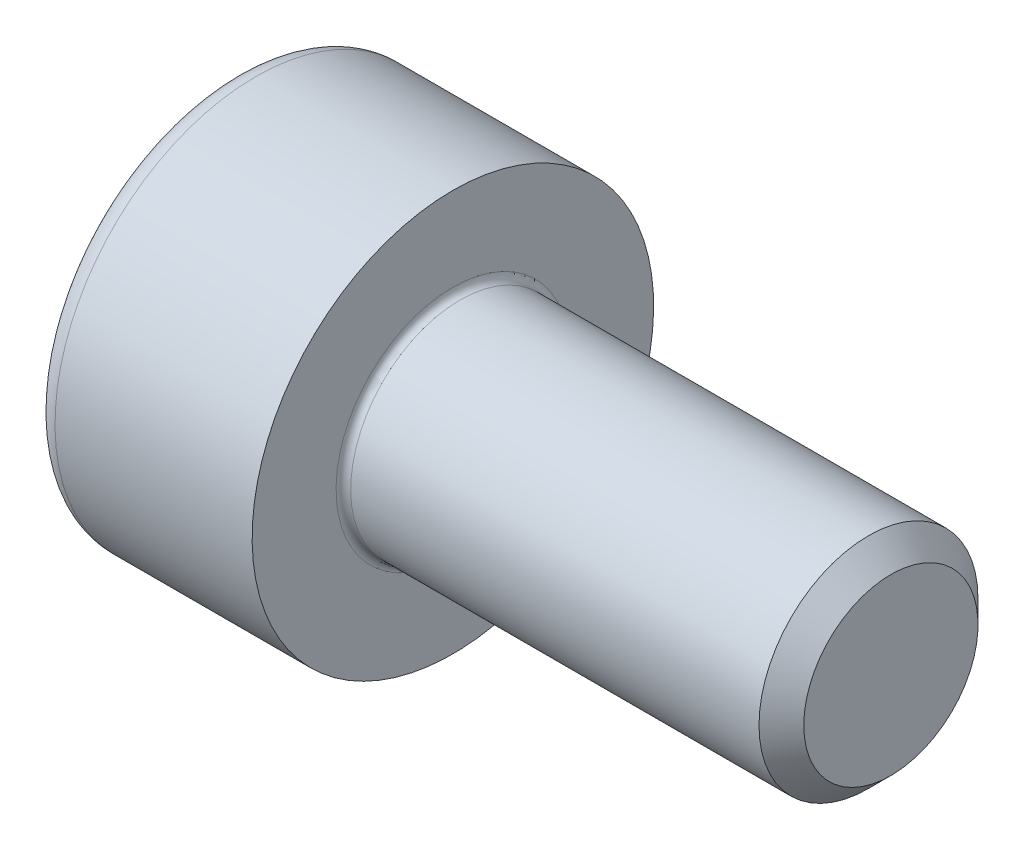
ISO-10303-21;
HEADER;
FILE_DESCRIPTION(('STEP AP214'),'2;1');
FILE_NAME('part.step','',(''),(''),'','','');
FILE_SCHEMA(('AUTOMOTIVE_DESIGN { 1 0 10303 214 1 1 1 1 }'));
ENDSEC;
DATA;
#1=APPLICATION_CONTEXT('core data for automotive mechanical design processes');
#2=APPLICATION_PROTOCOL_DEFINITION('international standard','automotive_design',2000,#1);
#3=PRODUCT_CONTEXT('',#1,'mechanical');
#4=PRODUCT('Part','Part','',(#3));
#5=PRODUCT_RELATED_PRODUCT_CATEGORY('part','',(#4));
#6=PRODUCT_DEFINITION_FORMATION('','',#4);
#7=PRODUCT_DEFINITION_CONTEXT('part definition',#1,'design');
#8=PRODUCT_DEFINITION('design','',#6,#7);
#9=PRODUCT_DEFINITION_SHAPE('','',#8);
#10=(LENGTH_UNIT() NAMED_UNIT(*) SI_UNIT(.MILLI.,.METRE.));
#11=(NAMED_UNIT(*) PLANE_ANGLE_UNIT() SI_UNIT($,.RADIAN.));
#12=(NAMED_UNIT(*) SI_UNIT($,.STERADIAN.) SOLID_ANGLE_UNIT());
#13=UNCERTAINTY_MEASURE_WITH_UNIT(LENGTH_MEASURE(1.E-05),#10,'distance_accuracy_value','');
#14=(GEOMETRIC_REPRESENTATION_CONTEXT(3) GLOBAL_UNCERTAINTY_ASSIGNED_CONTEXT((#13)) GLOBAL_UNIT_ASSIGNED_CONTEXT((#10,
#11,#12)) REPRESENTATION_CONTEXT('',''));
#15=CARTESIAN_POINT('',(0.,0.,0.));
#16=DIRECTION('',(0.,0.,1.));
#17=DIRECTION('',(1.,0.,0.));
#18=AXIS2_PLACEMENT_3D('',#15,#16,#17);
#19=CARTESIAN_POINT('',(-1.70500000086804,0.,0.));
#20=DIRECTION('',(-1.,0.,0.));
#21=DIRECTION('',(0.,0.,1.));
#22=AXIS2_PLACEMENT_3D('',#19,#20,#21);
#23=CONICAL_SURFACE('',#22,1.45203592649068,1.04719754999109);
#24=CARTESIAN_POINT('',(-0.866666665501725,0.,0.));
#25=VERTEX_POINT('',#24);
#26=VERTEX_LOOP('',#25);
#27=FACE_BOUND('',#26,.T.);
#28=CARTESIAN_POINT('',(-1.7000000009372,1.25000000021346,0.721687836216483));
#29=CARTESIAN_POINT('',(-1.68168471667994,1.25000000007667,0.658260216767755));
#30=CARTESIAN_POINT('',(-1.66502792415718,1.25000000002055,0.594285091020223));
#31=CARTESIAN_POINT('',(-1.63595399305092,1.2499999999794,0.4652271530211));
#32=CARTESIAN_POINT('',(-1.62354713859959,1.24999999999455,0.400142048406154));
#33=CARTESIAN_POINT('',(-1.604234975185,1.25000000000532,0.270778406250591));
#34=CARTESIAN_POINT('',(-1.59720111808345,1.25000000000142,0.206519767389044));
#35=CARTESIAN_POINT('',(-1.5888057309149,1.24999999999859,0.0777002892859716));
#36=CARTESIAN_POINT('',(-1.58743724707345,1.24999999999965,0.0131399179469562));
#37=CARTESIAN_POINT('',(-1.59029143221315,1.25000000000031,-0.107484209972956));
#38=CARTESIAN_POINT('',(-1.59381330414069,1.25000000000008,-0.16356606718727));
#39=CARTESIAN_POINT('',(-1.60497331386054,1.24999999999992,-0.275364426607982));
#40=CARTESIAN_POINT('',(-1.61261526015917,1.24999999999998,-0.331080542422315));
#41=CARTESIAN_POINT('',(-1.63171864680269,1.25000000000003,-0.443109217006171));
#42=CARTESIAN_POINT('',(-1.6432610273734,1.25000000000001,-0.499407604187637));
#43=CARTESIAN_POINT('',(-1.66945735155487,1.24999999999999,-0.611164930960381));
#44=CARTESIAN_POINT('',(-1.68410514402294,1.24999999999998,-0.666625301187755));
#45=CARTESIAN_POINT('',(-1.700000001076,1.25,-0.721687836213198));
#46=B_SPLINE_CURVE_WITH_KNOTS('',3,(#28,#29,#30,#31,#32,#33,#34,#35,#36,#37,#38,#39,#40,#41,#42,
#43,#44,#45),.UNSPECIFIED.,.F.,.F.,(4,2,2,2,2,2,2,2,4),(0.,0.198135007256359,0.39674613571563,
0.590442253939293,0.78390055567162,0.952317364102674,1.12089012092803,1.29320101371929,
1.46517373296543),.UNSPECIFIED.);
#47=CARTESIAN_POINT('',(-1.7000000010662,1.24999999986673,0.721687836410083));
#48=VERTEX_POINT('',#47);
#49=CARTESIAN_POINT('',(-1.70000000111063,1.25,-0.72168783633314));
#50=VERTEX_POINT('',#49);
#51=EDGE_CURVE('E21',#48,#50,#46,.T.);
#52=ORIENTED_EDGE('',*,*,#51,.T.);
#53=CARTESIAN_POINT('',(-1.7000000009372,1.24999999987243,-0.721687836807172));
#54=CARTESIAN_POINT('',(-1.68168471667994,1.19507007005986,-0.753401646413066));
#55=CARTESIAN_POINT('',(-1.66502792415718,1.13966598592414,-0.785389209238232));
#56=CARTESIAN_POINT('',(-1.63595399305092,1.02789853303629,-0.84991817820216));
#57=CARTESIAN_POINT('',(-1.62354713859959,0.971533179039347,-0.882460730522748));
#58=CARTESIAN_POINT('',(-1.604234975185,0.859500978611936,-0.947142551609857));
#59=CARTESIAN_POINT('',(-1.59720111808344,0.803851364943275,-0.979271871037253));
#60=CARTESIAN_POINT('',(-1.5888057309149,0.692290424402345,-1.04368161008634));
#61=CARTESIAN_POINT('',(-1.58743724707344,0.636379502745531,-1.07596179575676));
#62=CARTESIAN_POINT('',(-1.59029143221314,0.531915943657876,-1.13627385971729));
#63=CARTESIAN_POINT('',(-1.59381330414069,0.483347630618755,-1.16431478832425));
#64=CARTESIAN_POINT('',(-1.60497331386054,0.386527411258912,-1.22021396803447));
#65=CARTESIAN_POINT('',(-1.61261526015917,0.338275839563533,-1.24807202594168));
#66=CARTESIAN_POINT('',(-1.63171864680269,0.241256161421637,-1.30408636323365));
#67=CARTESIAN_POINT('',(-1.6432610273734,0.192500327930389,-1.33223555682438));
#68=CARTESIAN_POINT('',(-1.66945735155487,0.0957156438861422,-1.38811422021073));
#69=CARTESIAN_POINT('',(-1.68410514402294,0.0476855543659396,-1.4158444053244));
#70=CARTESIAN_POINT('',(-1.700000001076,2.37148032441625E-10,-1.44337567283715));
#71=B_SPLINE_CURVE_WITH_KNOTS('',3,(#53,#54,#55,#56,#57,#58,#59,#60,#61,#62,#63,#64,#65,#66,#67,
#68,#69,#70),.UNSPECIFIED.,.F.,.F.,(4,2,2,2,2,2,2,2,4),(0.,0.198135007256359,0.39674613571563,
0.590442253939292,0.78390055567162,0.952317364102674,1.12089012092803,1.2932010137193,
1.46517373296543),.UNSPECIFIED.);
#72=CARTESIAN_POINT('',(-1.7000000010662,0.,-1.44337567282017));
#73=VERTEX_POINT('',#72);
#74=EDGE_CURVE('E81',#50,#73,#71,.T.);
#75=ORIENTED_EDGE('',*,*,#74,.T.);
#76=CARTESIAN_POINT('',(-1.7000000009372,-3.41032918427961E-10,-1.44337567302366));
#77=CARTESIAN_POINT('',(-1.68168471667994,-0.0549299300168043,-1.41166186318082));
#78=CARTESIAN_POINT('',(-1.66502792415718,-0.110334014096412,-1.37967430025846));
#79=CARTESIAN_POINT('',(-1.63595399305092,-0.222101466943117,-1.31514533122326));
#80=CARTESIAN_POINT('',(-1.62354713859959,-0.2784668209552,-1.2826027789289));
#81=CARTESIAN_POINT('',(-1.604234975185,-0.390499021393382,-1.21792095786045));
#82=CARTESIAN_POINT('',(-1.59720111808344,-0.446148635058142,-1.1857916384263));
#83=CARTESIAN_POINT('',(-1.5888057309149,-0.557709575596239,-1.12138189937231));
#84=CARTESIAN_POINT('',(-1.58743724707344,-0.613620497254114,-1.08910171370372));
#85=CARTESIAN_POINT('',(-1.59029143221314,-0.718084056342434,-1.02878964974434));
#86=CARTESIAN_POINT('',(-1.59381330414069,-0.766652369381328,-1.00074872113699));
#87=CARTESIAN_POINT('',(-1.60497331386054,-0.863472588741005,-0.944849541426487));
#88=CARTESIAN_POINT('',(-1.61261526015917,-0.911724160436443,-0.916991483519372));
#89=CARTESIAN_POINT('',(-1.63171864680269,-1.00874383857839,-0.860977146227485));
#90=CARTESIAN_POINT('',(-1.6432610273734,-1.05749967206962,-0.832827952636742));
#91=CARTESIAN_POINT('',(-1.66945735155487,-1.15428435611385,-0.776949289250349));
#92=CARTESIAN_POINT('',(-1.68410514402294,-1.20231444563404,-0.749219104136651));
#93=CARTESIAN_POINT('',(-1.700000001076,-1.24999999976285,-0.721687836623951));
#94=B_SPLINE_CURVE_WITH_KNOTS('',3,(#76,#77,#78,#79,#80,#81,#82,#83,#84,#85,#86,#87,#88,#89,#90,
#91,#92,#93),.UNSPECIFIED.,.F.,.F.,(4,2,2,2,2,2,2,2,4),(0.,0.198135007256359,0.39674613571563,
0.590442253939293,0.783900555671621,0.952317364102675,1.12089012092803,1.2932010137193,
1.46517373296543),.UNSPECIFIED.);
#95=CARTESIAN_POINT('',(-1.7000000010662,-1.24999999986673,-0.721687836410085));
#96=VERTEX_POINT('',#95);
#97=EDGE_CURVE('E106',#73,#96,#94,.T.);
#98=ORIENTED_EDGE('',*,*,#97,.T.);
#99=CARTESIAN_POINT('',(-1.7000000009372,-1.25000000021346,-0.721687836216485));
#100=CARTESIAN_POINT('',(-1.68168471667994,-1.25000000007667,-0.658260216767758));
#101=CARTESIAN_POINT('',(-1.66502792415718,-1.25000000002055,-0.594285091020225));
#102=CARTESIAN_POINT('',(-1.63595399305092,-1.2499999999794,-0.465227153021103));
#103=CARTESIAN_POINT('',(-1.62354713859959,-1.24999999999455,-0.400142048406156));
#104=CARTESIAN_POINT('',(-1.604234975185,-1.25000000000532,-0.270778406250594));
#105=CARTESIAN_POINT('',(-1.59720111808345,-1.25000000000142,-0.206519767389046));
#106=CARTESIAN_POINT('',(-1.5888057309149,-1.24999999999859,-0.0777002892859738));
#107=CARTESIAN_POINT('',(-1.58743724707345,-1.24999999999965,-0.0131399179469584));
#108=CARTESIAN_POINT('',(-1.59029143221314,-1.25000000000031,0.107484209972954));
#109=CARTESIAN_POINT('',(-1.59381330414069,-1.25000000000008,0.163566067187268));
#110=CARTESIAN_POINT('',(-1.60497331386054,-1.24999999999992,0.27536442660798));
#111=CARTESIAN_POINT('',(-1.61261526015917,-1.24999999999998,0.331080542422314));
#112=CARTESIAN_POINT('',(-1.63171864680269,-1.25000000000003,0.44310921700617));
#113=CARTESIAN_POINT('',(-1.6432610273734,-1.25000000000001,0.499407604187636));
#114=CARTESIAN_POINT('',(-1.66945735155487,-1.24999999999999,0.61116493096038));
#115=CARTESIAN_POINT('',(-1.68410514402294,-1.24999999999998,0.666625301187754));
#116=CARTESIAN_POINT('',(-1.700000001076,-1.25,0.721687836213197));
#117=B_SPLINE_CURVE_WITH_KNOTS('',3,(#99,#100,#101,#102,#103,#104,#105,#106,#107,#108,#109,#110,
#111,#112,#113,#114,#115,#116),.UNSPECIFIED.,.F.,.F.,(4,2,2,2,2,2,2,2,4),(0.,0.198135007256359,
0.39674613571563,0.590442253939293,0.783900555671621,0.952317364102675,1.12089012092803,
1.2932010137193,1.46517373296543),.UNSPECIFIED.);
#118=CARTESIAN_POINT('',(-1.7000000010662,-1.24999999986673,0.721687836410086));
#119=VERTEX_POINT('',#118);
#120=EDGE_CURVE('E130',#96,#119,#117,.T.);
#121=ORIENTED_EDGE('',*,*,#120,.T.);
#122=CARTESIAN_POINT('',(-1.7000000009372,-1.24999999987243,0.721687836807171));
#123=CARTESIAN_POINT('',(-1.68168471667994,-1.19507007005986,0.753401646413066));
#124=CARTESIAN_POINT('',(-1.66502792415718,-1.13966598592414,0.785389209238232));
#125=CARTESIAN_POINT('',(-1.63595399305092,-1.02789853303629,0.84991817820216));
#126=CARTESIAN_POINT('',(-1.62354713859959,-0.971533179039349,0.882460730522749));
#127=CARTESIAN_POINT('',(-1.604234975185,-0.859500978611937,0.947142551609858));
#128=CARTESIAN_POINT('',(-1.59720111808345,-0.803851364943277,0.979271871037254));
#129=CARTESIAN_POINT('',(-1.5888057309149,-0.692290424402346,1.04368161008634));
#130=CARTESIAN_POINT('',(-1.58743724707345,-0.636379502745532,1.07596179575676));
#131=CARTESIAN_POINT('',(-1.59029143221314,-0.531915943657877,1.13627385971729));
#132=CARTESIAN_POINT('',(-1.59381330414069,-0.483347630618756,1.16431478832426));
#133=CARTESIAN_POINT('',(-1.60497331386054,-0.386527411258913,1.22021396803447));
#134=CARTESIAN_POINT('',(-1.61261526015917,-0.338275839563534,1.24807202594169));
#135=CARTESIAN_POINT('',(-1.63171864680269,-0.241256161421638,1.30408636323366));
#136=CARTESIAN_POINT('',(-1.6432610273734,-0.192500327930391,1.33223555682438));
#137=CARTESIAN_POINT('',(-1.66945735155487,-0.0957156438861436,1.38811422021073));
#138=CARTESIAN_POINT('',(-1.68410514402294,-0.047685554365941,1.4158444053244));
#139=CARTESIAN_POINT('',(-1.700000001076,-2.37149471103395E-10,1.44337567283715));
#140=B_SPLINE_CURVE_WITH_KNOTS('',3,(#122,#123,#124,#125,#126,#127,#128,#129,#130,#131,#132,
#133,#134,#135,#136,#137,#138,#139),.UNSPECIFIED.,.F.,.F.,(4,2,2,2,2,2,2,2,4),(0.,
0.198135007256359,0.396746135715631,0.590442253939293,0.783900555671621,0.952317364102675,
1.12089012092803,1.2932010137193,1.46517373296543),.UNSPECIFIED.);
#141=CARTESIAN_POINT('',(-1.7000000010662,0.,1.44337567282017));
#142=VERTEX_POINT('',#141);
#143=EDGE_CURVE('E138',#119,#142,#140,.T.);
#144=ORIENTED_EDGE('',*,*,#143,.T.);
#145=CARTESIAN_POINT('',(-1.7000000009372,3.41031560735955E-10,1.44337567302366));
#146=CARTESIAN_POINT('',(-1.68168471667994,0.054929930016803,1.41166186318082));
#147=CARTESIAN_POINT('',(-1.66502792415718,0.110334014096411,1.37967430025846));
#148=CARTESIAN_POINT('',(-1.63595399305092,0.222101466943115,1.31514533122326));
#149=CARTESIAN_POINT('',(-1.62354713859959,0.278466820955199,1.2826027789289));
#150=CARTESIAN_POINT('',(-1.604234975185,0.39049902139338,1.21792095786045));
#151=CARTESIAN_POINT('',(-1.59720111808344,0.446148635058141,1.1857916384263));
#152=CARTESIAN_POINT('',(-1.5888057309149,0.557709575596238,1.12138189937231));
#153=CARTESIAN_POINT('',(-1.58743724707344,0.613620497254112,1.08910171370372));
#154=CARTESIAN_POINT('',(-1.59029143221314,0.718084056342432,1.02878964974434));
#155=CARTESIAN_POINT('',(-1.59381330414069,0.766652369381327,1.00074872113699));
#156=CARTESIAN_POINT('',(-1.60497331386054,0.863472588741004,0.944849541426486));
#157=CARTESIAN_POINT('',(-1.61261526015917,0.911724160436443,0.91699148351937));
#158=CARTESIAN_POINT('',(-1.63171864680269,1.00874383857839,0.860977146227483));
#159=CARTESIAN_POINT('',(-1.6432610273734,1.05749967206962,0.83282795263674));
#160=CARTESIAN_POINT('',(-1.66945735155487,1.15428435611385,0.776949289250346));
#161=CARTESIAN_POINT('',(-1.68410514402294,1.20231444563404,0.749219104136648));
#162=CARTESIAN_POINT('',(-1.700000001076,1.24999999976285,0.721687836623948));
#163=B_SPLINE_CURVE_WITH_KNOTS('',3,(#145,#146,#147,#148,#149,#150,#151,#152,#153,#154,#155,
#156,#157,#158,#159,#160,#161,#162),.UNSPECIFIED.,.F.,.F.,(4,2,2,2,2,2,2,2,4),(0.,
0.198135007256359,0.396746135715631,0.590442253939293,0.783900555671621,0.952317364102676,
1.12089012092803,1.2932010137193,1.46517373296543),.UNSPECIFIED.);
#164=EDGE_CURVE('E83',#142,#48,#163,.T.);
#165=ORIENTED_EDGE('',*,*,#164,.T.);
#166=EDGE_LOOP('',(#52,#75,#98,#121,#144,#165));
#167=FACE_BOUND('',#166,.T.);
#168=ADVANCED_FACE('F17',(#27,#167),#23,.F.);
#169=CARTESIAN_POINT('',(-3.,1.25,0.721687836487031));
#170=DIRECTION('',(0.,1.,0.));
#171=DIRECTION('',(0.,0.,1.));
#172=AXIS2_PLACEMENT_3D('',#169,#170,#171);
#173=PLANE('',#172);
#174=DIRECTION('',(1.,0.,0.));
#175=VECTOR('',#174,1.);
#176=CARTESIAN_POINT('',(-3.,1.25,0.72168783648703));
#177=LINE('',#176,#175);
#178=CARTESIAN_POINT('',(-3.,1.25,0.721687836487031));
#179=VERTEX_POINT('',#178);
#180=EDGE_CURVE('E85',#48,#179,#177,.F.);
#181=ORIENTED_EDGE('',*,*,#180,.T.);
#182=DIRECTION('',(0.,0.,1.));
#183=VECTOR('',#182,1.);
#184=CARTESIAN_POINT('',(-3.,1.25,0.));
#185=LINE('',#184,#183);
#186=CARTESIAN_POINT('',(-3.,1.25,-0.721687836487033));
#187=VERTEX_POINT('',#186);
#188=EDGE_CURVE('E90',#187,#179,#185,.T.);
#189=ORIENTED_EDGE('',*,*,#188,.F.);
#190=DIRECTION('',(1.,0.,0.));
#191=VECTOR('',#190,1.);
#192=CARTESIAN_POINT('',(-3.,1.25,-0.721687836487033));
#193=LINE('',#192,#191);
#194=EDGE_CURVE('E88',#187,#50,#193,.T.);
#195=ORIENTED_EDGE('',*,*,#194,.T.);
#196=ORIENTED_EDGE('',*,*,#51,.F.);
#197=EDGE_LOOP('',(#181,#189,#195,#196));
#198=FACE_BOUND('',#197,.T.);
#199=ADVANCED_FACE('F77',(#198),#173,.F.);
#200=CARTESIAN_POINT('',(-3.,0.,1.44337567297406));
#201=DIRECTION('',(0.,0.500000000000001,0.866025403784438));
#202=DIRECTION('',(0.,-0.866025403784438,0.500000000000001));
#203=AXIS2_PLACEMENT_3D('',#200,#201,#202);
#204=PLANE('',#203);
#205=DIRECTION('',(1.,0.,0.));
#206=VECTOR('',#205,1.);
#207=CARTESIAN_POINT('',(-3.,0.,1.44337567297407));
#208=LINE('',#207,#206);
#209=CARTESIAN_POINT('',(-3.,0.,1.44337567297407));
#210=VERTEX_POINT('',#209);
#211=EDGE_CURVE('E142',#142,#210,#208,.F.);
#212=ORIENTED_EDGE('',*,*,#211,.T.);
#213=DIRECTION('',(0.,-0.866025403784438,0.5));
#214=VECTOR('',#213,1.);
#215=CARTESIAN_POINT('',(-3.,1.25,0.721687836487031));
#216=LINE('',#215,#214);
#217=EDGE_CURVE('E96',#179,#210,#216,.T.);
#218=ORIENTED_EDGE('',*,*,#217,.F.);
#219=ORIENTED_EDGE('',*,*,#180,.F.);
#220=ORIENTED_EDGE('',*,*,#164,.F.);
#221=EDGE_LOOP('',(#212,#218,#219,#220));
#222=FACE_BOUND('',#221,.T.);
#223=ADVANCED_FACE('F146',(#222),#204,.F.);
#224=CARTESIAN_POINT('',(-3.,-1.25,0.721687836487033));
#225=DIRECTION('',(0.,-0.5,0.866025403784439));
#226=DIRECTION('',(0.,-0.866025403784439,-0.5));
#227=AXIS2_PLACEMENT_3D('',#224,#225,#226);
#228=PLANE('',#227);
#229=DIRECTION('',(1.,0.,0.));
#230=VECTOR('',#229,1.);
#231=CARTESIAN_POINT('',(-3.,-1.25,0.721687836487033));
#232=LINE('',#231,#230);
#233=CARTESIAN_POINT('',(-3.,-1.25,0.721687836487033));
#234=VERTEX_POINT('',#233);
#235=EDGE_CURVE('E137',#119,#234,#232,.F.);
#236=ORIENTED_EDGE('',*,*,#235,.T.);
#237=DIRECTION('',(0.,-0.866025403784439,-0.499999999999999));
#238=VECTOR('',#237,1.);
#239=CARTESIAN_POINT('',(-3.,0.,1.44337567297406));
#240=LINE('',#239,#238);
#241=EDGE_CURVE('E265',#210,#234,#240,.T.);
#242=ORIENTED_EDGE('',*,*,#241,.F.);
#243=ORIENTED_EDGE('',*,*,#211,.F.);
#244=ORIENTED_EDGE('',*,*,#143,.F.);
#245=EDGE_LOOP('',(#236,#242,#243,#244));
#246=FACE_BOUND('',#245,.T.);
#247=ADVANCED_FACE('F126',(#246),#228,.F.);
#248=CARTESIAN_POINT('',(-3.,-1.25,-0.721687836487032));
#249=DIRECTION('',(0.,-1.,0.));
#250=DIRECTION('',(0.,0.,-1.));
#251=AXIS2_PLACEMENT_3D('',#248,#249,#250);
#252=PLANE('',#251);
#253=DIRECTION('',(1.,0.,0.));
#254=VECTOR('',#253,1.);
#255=CARTESIAN_POINT('',(-3.,-1.25,-0.721687836487032));
#256=LINE('',#255,#254);
#257=CARTESIAN_POINT('',(-3.,-1.25,-0.721687836487032));
#258=VERTEX_POINT('',#257);
#259=EDGE_CURVE('E136',#96,#258,#256,.F.);
#260=ORIENTED_EDGE('',*,*,#259,.T.);
#261=DIRECTION('',(0.,0.,1.));
#262=VECTOR('',#261,1.);
#263=CARTESIAN_POINT('',(-3.,-1.25,0.));
#264=LINE('',#263,#262);
#265=EDGE_CURVE('E260',#234,#258,#264,.F.);
#266=ORIENTED_EDGE('',*,*,#265,.F.);
#267=ORIENTED_EDGE('',*,*,#235,.F.);
#268=ORIENTED_EDGE('',*,*,#120,.F.);
#269=EDGE_LOOP('',(#260,#266,#267,#268));
#270=FACE_BOUND('',#269,.T.);
#271=ADVANCED_FACE('F122',(#270),#252,.F.);
#272=CARTESIAN_POINT('',(-3.,0.,-1.44337567297406));
#273=DIRECTION('',(0.,-0.5,-0.866025403784439));
#274=DIRECTION('',(0.,0.866025403784439,-0.5));
#275=AXIS2_PLACEMENT_3D('',#272,#273,#274);
#276=PLANE('',#275);
#277=DIRECTION('',(1.,0.,0.));
#278=VECTOR('',#277,1.);
#279=CARTESIAN_POINT('',(-3.,0.,-1.44337567297407));
#280=LINE('',#279,#278);
#281=CARTESIAN_POINT('',(-3.,0.,-1.44337567297407));
#282=VERTEX_POINT('',#281);
#283=EDGE_CURVE('E39',#73,#282,#280,.F.);
#284=ORIENTED_EDGE('',*,*,#283,.T.);
#285=DIRECTION('',(0.,0.866025403784438,-0.5));
#286=VECTOR('',#285,1.);
#287=CARTESIAN_POINT('',(-3.,-1.25,-0.721687836487032));
#288=LINE('',#287,#286);
#289=EDGE_CURVE('E255',#258,#282,#288,.T.);
#290=ORIENTED_EDGE('',*,*,#289,.F.);
#291=ORIENTED_EDGE('',*,*,#259,.F.);
#292=ORIENTED_EDGE('',*,*,#97,.F.);
#293=EDGE_LOOP('',(#284,#290,#291,#292));
#294=FACE_BOUND('',#293,.T.);
#295=ADVANCED_FACE('F116',(#294),#276,.F.);
#296=CARTESIAN_POINT('',(-3.,1.25,-0.721687836487033));
#297=DIRECTION('',(0.,0.5,-0.866025403784439));
#298=DIRECTION('',(0.,0.866025403784439,0.5));
#299=AXIS2_PLACEMENT_3D('',#296,#297,#298);
#300=PLANE('',#299);
#301=ORIENTED_EDGE('',*,*,#194,.F.);
#302=DIRECTION('',(0.,0.866025403784439,0.5));
#303=VECTOR('',#302,1.);
#304=CARTESIAN_POINT('',(-3.,0.,-1.44337567297406));
#305=LINE('',#304,#303);
#306=EDGE_CURVE('E253',#282,#187,#305,.T.);
#307=ORIENTED_EDGE('',*,*,#306,.F.);
#308=ORIENTED_EDGE('',*,*,#283,.F.);
#309=ORIENTED_EDGE('',*,*,#74,.F.);
#310=EDGE_LOOP('',(#301,#307,#308,#309));
#311=FACE_BOUND('',#310,.T.);
#312=ADVANCED_FACE('F94',(#311),#300,.F.);
#313=CARTESIAN_POINT('',(-3.,2.09668783648703,0.));
#314=DIRECTION('',(-1.,0.,0.));
#315=DIRECTION('',(0.,0.,1.));
#316=AXIS2_PLACEMENT_3D('',#313,#314,#315);
#317=PLANE('',#316);
#318=ORIENTED_EDGE('',*,*,#289,.T.);
#319=ORIENTED_EDGE('',*,*,#306,.T.);
#320=ORIENTED_EDGE('',*,*,#188,.T.);
#321=ORIENTED_EDGE('',*,*,#217,.T.);
#322=ORIENTED_EDGE('',*,*,#241,.T.);
#323=ORIENTED_EDGE('',*,*,#265,.T.);
#324=EDGE_LOOP('',(#318,#319,#320,#321,#322,#323));
#325=FACE_BOUND('',#324,.T.);
#326=CARTESIAN_POINT('',(-2.99999999999999,0.,0.));
#327=DIRECTION('',(1.,0.,0.));
#328=DIRECTION('',(0.,1.,0.));
#329=AXIS2_PLACEMENT_3D('',#326,#327,#328);
#330=CIRCLE('',#329,2.45);
#331=CARTESIAN_POINT('',(-2.99999999999999,2.45,0.));
#332=VERTEX_POINT('',#331);
#333=EDGE_CURVE('E216',#332,#332,#330,.T.);
#334=ORIENTED_EDGE('',*,*,#333,.F.);
#335=EDGE_LOOP('',(#334));
#336=FACE_BOUND('',#335,.T.);
#337=ADVANCED_FACE('F115',(#325,#336),#317,.T.);
#338=CARTESIAN_POINT('',(-2.69999999999999,0.,0.));
#339=DIRECTION('',(1.,0.,0.));
#340=DIRECTION('',(0.,0.,-1.));
#341=AXIS2_PLACEMENT_3D('',#338,#339,#340);
#342=TOROIDAL_SURFACE('',#341,2.45,0.3);
#343=CARTESIAN_POINT('',(-2.69999999999999,0.,0.));
#344=DIRECTION('',(1.,0.,0.));
#345=DIRECTION('',(0.,1.,0.));
#346=AXIS2_PLACEMENT_3D('',#343,#344,#345);
#347=CIRCLE('',#346,2.75);
#348=CARTESIAN_POINT('',(-2.69999999999999,2.75,0.));
#349=VERTEX_POINT('',#348);
#350=EDGE_CURVE('E280',#349,#349,#347,.T.);
#351=ORIENTED_EDGE('',*,*,#350,.F.);
#352=EDGE_LOOP('',(#351));
#353=FACE_BOUND('',#352,.T.);
#354=ORIENTED_EDGE('',*,*,#333,.T.);
#355=EDGE_LOOP('',(#354));
#356=FACE_BOUND('',#355,.T.);
#357=ADVANCED_FACE('F200',(#353,#356),#342,.T.);
#358=CARTESIAN_POINT('',(-1.5,0.,0.));
#359=DIRECTION('',(1.,0.,0.));
#360=DIRECTION('',(0.,1.,0.));
#361=AXIS2_PLACEMENT_3D('',#358,#359,#360);
#362=CYLINDRICAL_SURFACE('',#361,2.75);
#363=ORIENTED_EDGE('',*,*,#350,.T.);
#364=EDGE_LOOP('',(#363));
#365=FACE_BOUND('',#364,.T.);
#366=CARTESIAN_POINT('',(0.,0.,0.));
#367=DIRECTION('',(1.,0.,0.));
#368=DIRECTION('',(0.,1.,0.));
#369=AXIS2_PLACEMENT_3D('',#366,#367,#368);
#370=CIRCLE('',#369,2.75);
#371=CARTESIAN_POINT('',(0.,2.75,0.));
#372=VERTEX_POINT('',#371);
#373=EDGE_CURVE('E104',#372,#372,#370,.T.);
#374=ORIENTED_EDGE('',*,*,#373,.F.);
#375=EDGE_LOOP('',(#374));
#376=FACE_BOUND('',#375,.T.);
#377=ADVANCED_FACE('F197',(#365,#376),#362,.T.);
#378=CARTESIAN_POINT('',(6.00000000000001,0.749999999999999,0.));
#379=DIRECTION('',(1.,0.,0.));
#380=DIRECTION('',(0.,0.,-1.));
#381=AXIS2_PLACEMENT_3D('',#378,#379,#380);
#382=PLANE('',#381);
#383=CARTESIAN_POINT('',(6.00000000014234,0.,0.));
#384=DIRECTION('',(-1.,0.,0.));
#385=DIRECTION('',(0.,0.,1.));
#386=AXIS2_PLACEMENT_3D('',#383,#384,#385);
#387=CIRCLE('',#386,1.19327500010513);
#388=CARTESIAN_POINT('',(6.00000000014234,0.,1.19327500010513));
#389=VERTEX_POINT('',#388);
#390=EDGE_CURVE('E275',#389,#389,#387,.T.);
#391=ORIENTED_EDGE('',*,*,#390,.F.);
#392=EDGE_LOOP('',(#391));
#393=FACE_BOUND('',#392,.T.);
#394=ADVANCED_FACE('F194',(#393),#382,.T.);
#395=CARTESIAN_POINT('',(0.,2.125,0.));
#396=DIRECTION('',(1.,0.,0.));
#397=DIRECTION('',(0.,0.,-1.));
#398=AXIS2_PLACEMENT_3D('',#395,#396,#397);
#399=PLANE('',#398);
#400=CARTESIAN_POINT('',(0.,0.,0.));
#401=DIRECTION('',(1.,0.,0.));
#402=DIRECTION('',(0.,1.,0.));
#403=AXIS2_PLACEMENT_3D('',#400,#401,#402);
#404=CIRCLE('',#403,1.6);
#405=CARTESIAN_POINT('',(0.,1.6,0.));
#406=VERTEX_POINT('',#405);
#407=EDGE_CURVE('E181',#406,#406,#404,.F.);
#408=ORIENTED_EDGE('',*,*,#407,.T.);
#409=EDGE_LOOP('',(#408));
#410=FACE_BOUND('',#409,.T.);
#411=ORIENTED_EDGE('',*,*,#373,.T.);
#412=EDGE_LOOP('',(#411));
#413=FACE_BOUND('',#412,.T.);
#414=ADVANCED_FACE('F185',(#410,#413),#399,.T.);
#415=CARTESIAN_POINT('',(5.69327499982819,0.,0.));
#416=DIRECTION('',(-1.,0.,0.));
#417=DIRECTION('',(0.,0.,1.));
#418=AXIS2_PLACEMENT_3D('',#415,#416,#417);
#419=CONICAL_SURFACE('',#418,1.49999999990769,0.785398162563492);
#420=ORIENTED_EDGE('',*,*,#390,.T.);
#421=EDGE_LOOP('',(#420));
#422=FACE_BOUND('',#421,.T.);
#423=CARTESIAN_POINT('',(5.69327500000001,0.,0.));
#424=DIRECTION('',(1.,0.,0.));
#425=DIRECTION('',(0.,1.,0.));
#426=AXIS2_PLACEMENT_3D('',#423,#424,#425);
#427=CIRCLE('',#426,1.5);
#428=CARTESIAN_POINT('',(5.69327500000001,1.5,0.));
#429=VERTEX_POINT('',#428);
#430=EDGE_CURVE('E30',#429,#429,#427,.F.);
#431=ORIENTED_EDGE('',*,*,#430,.F.);
#432=EDGE_LOOP('',(#431));
#433=FACE_BOUND('',#432,.T.);
#434=ADVANCED_FACE('F163',(#422,#433),#419,.T.);
#435=CARTESIAN_POINT('',(0.100000000000002,0.,0.));
#436=DIRECTION('',(1.,0.,0.));
#437=DIRECTION('',(0.,0.,-1.));
#438=AXIS2_PLACEMENT_3D('',#435,#436,#437);
#439=TOROIDAL_SURFACE('',#438,1.6,0.1);
#440=CARTESIAN_POINT('',(0.100000000000002,0.,0.));
#441=DIRECTION('',(1.,0.,0.));
#442=DIRECTION('',(0.,1.,0.));
#443=AXIS2_PLACEMENT_3D('',#440,#441,#442);
#444=CIRCLE('',#443,1.5);
#445=CARTESIAN_POINT('',(0.100000000000002,1.5,0.));
#446=VERTEX_POINT('',#445);
#447=EDGE_CURVE('E11',#446,#446,#444,.T.);
#448=ORIENTED_EDGE('',*,*,#447,.F.);
#449=EDGE_LOOP('',(#448));
#450=FACE_BOUND('',#449,.T.);
#451=ORIENTED_EDGE('',*,*,#407,.F.);
#452=EDGE_LOOP('',(#451));
#453=FACE_BOUND('',#452,.T.);
#454=ADVANCED_FACE('F157',(#450,#453),#439,.F.);
#455=CARTESIAN_POINT('',(3.625,0.,0.));
#456=DIRECTION('',(1.,0.,0.));
#457=DIRECTION('',(0.,1.,0.));
#458=AXIS2_PLACEMENT_3D('',#455,#456,#457);
#459=CYLINDRICAL_SURFACE('',#458,1.5);
#460=ORIENTED_EDGE('',*,*,#447,.T.);
#461=EDGE_LOOP('',(#460));
#462=FACE_BOUND('',#461,.T.);
#463=ORIENTED_EDGE('',*,*,#430,.T.);
#464=EDGE_LOOP('',(#463));
#465=FACE_BOUND('',#464,.T.);
#466=ADVANCED_FACE('F155',(#462,#465),#459,.T.);
#467=CLOSED_SHELL('',(#168,#199,#223,#247,#271,#295,#312,#337,#357,#377,#394,#414,#434,#454,#466));
#468=MANIFOLD_SOLID_BREP('B1',#467);
#469=ADVANCED_BREP_SHAPE_REPRESENTATION('',(#18,#468),#14);
#470=SHAPE_DEFINITION_REPRESENTATION(#9,#469);
ENDSEC;
END-ISO-10303-21;
